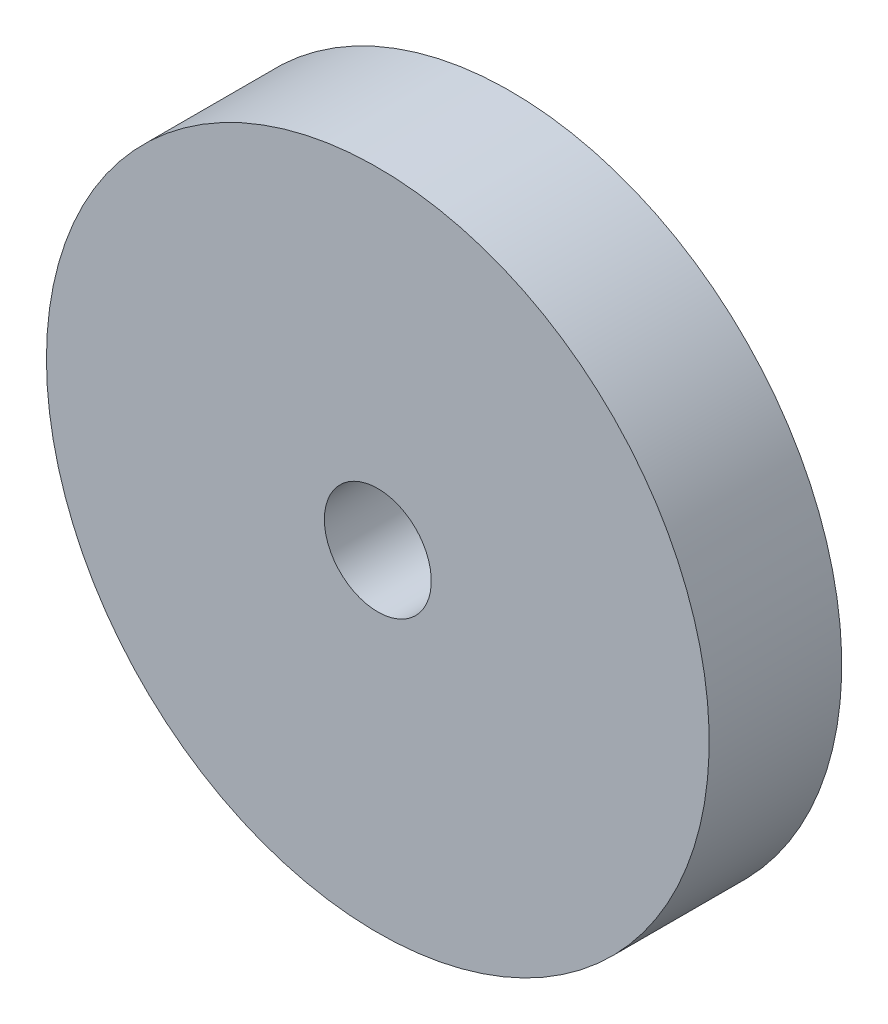
ISO-10303-21;
HEADER;
FILE_DESCRIPTION(('STEP AP214'),'2;1');
FILE_NAME('part.step','',(''),(''),'','','');
FILE_SCHEMA(('AUTOMOTIVE_DESIGN { 1 0 10303 214 1 1 1 1 }'));
ENDSEC;
DATA;
#1=APPLICATION_CONTEXT('core data for automotive mechanical design processes');
#2=APPLICATION_PROTOCOL_DEFINITION('international standard','automotive_design',2000,#1);
#3=PRODUCT_CONTEXT('',#1,'mechanical');
#4=PRODUCT('Part','Part','',(#3));
#5=PRODUCT_RELATED_PRODUCT_CATEGORY('part','',(#4));
#6=PRODUCT_DEFINITION_FORMATION('','',#4);
#7=PRODUCT_DEFINITION_CONTEXT('part definition',#1,'design');
#8=PRODUCT_DEFINITION('design','',#6,#7);
#9=PRODUCT_DEFINITION_SHAPE('','',#8);
#10=(LENGTH_UNIT() NAMED_UNIT(*) SI_UNIT(.MILLI.,.METRE.));
#11=(NAMED_UNIT(*) PLANE_ANGLE_UNIT() SI_UNIT($,.RADIAN.));
#12=(NAMED_UNIT(*) SI_UNIT($,.STERADIAN.) SOLID_ANGLE_UNIT());
#13=UNCERTAINTY_MEASURE_WITH_UNIT(LENGTH_MEASURE(1.E-05),#10,'distance_accuracy_value','');
#14=(GEOMETRIC_REPRESENTATION_CONTEXT(3) GLOBAL_UNCERTAINTY_ASSIGNED_CONTEXT((#13)) GLOBAL_UNIT_ASSIGNED_CONTEXT((#10,
#11,#12)) REPRESENTATION_CONTEXT('',''));
#15=CARTESIAN_POINT('',(0.,0.,0.));
#16=DIRECTION('',(0.,0.,1.));
#17=DIRECTION('',(1.,0.,0.));
#18=AXIS2_PLACEMENT_3D('',#15,#16,#17);
#19=CARTESIAN_POINT('',(0.,0.,6.2));
#20=DIRECTION('',(0.,0.,1.));
#21=DIRECTION('',(1.,0.,0.));
#22=AXIS2_PLACEMENT_3D('',#19,#20,#21);
#23=PLANE('',#22);
#24=CARTESIAN_POINT('',(0.,0.,6.2));
#25=DIRECTION('',(0.,0.,1.));
#26=DIRECTION('',(1.,0.,0.));
#27=AXIS2_PLACEMENT_3D('',#24,#25,#26);
#28=CIRCLE('',#27,15.5);
#29=CARTESIAN_POINT('',(-15.5,0.,6.2));
#30=VERTEX_POINT('',#29);
#31=EDGE_CURVE('E10',#30,#30,#28,.T.);
#32=ORIENTED_EDGE('',*,*,#31,.T.);
#33=EDGE_LOOP('',(#32));
#34=FACE_BOUND('',#33,.T.);
#35=CARTESIAN_POINT('',(0.,0.,6.2));
#36=DIRECTION('',(0.,0.,1.));
#37=DIRECTION('',(1.,0.,0.));
#38=AXIS2_PLACEMENT_3D('',#35,#36,#37);
#39=CIRCLE('',#38,2.5);
#40=CARTESIAN_POINT('',(-2.5,0.,6.2));
#41=VERTEX_POINT('',#40);
#42=EDGE_CURVE('E42',#41,#41,#39,.T.);
#43=ORIENTED_EDGE('',*,*,#42,.F.);
#44=EDGE_LOOP('',(#43));
#45=FACE_BOUND('',#44,.T.);
#46=ADVANCED_FACE('F31',(#34,#45),#23,.T.);
#47=CARTESIAN_POINT('',(0.,0.,0.));
#48=DIRECTION('',(0.,0.,1.));
#49=DIRECTION('',(1.,0.,0.));
#50=AXIS2_PLACEMENT_3D('',#47,#48,#49);
#51=PLANE('',#50);
#52=CARTESIAN_POINT('',(0.,0.,0.));
#53=DIRECTION('',(0.,0.,1.));
#54=DIRECTION('',(1.,0.,0.));
#55=AXIS2_PLACEMENT_3D('',#52,#53,#54);
#56=CIRCLE('',#55,15.5);
#57=CARTESIAN_POINT('',(-15.5,0.,0.));
#58=VERTEX_POINT('',#57);
#59=EDGE_CURVE('E35',#58,#58,#56,.T.);
#60=ORIENTED_EDGE('',*,*,#59,.F.);
#61=EDGE_LOOP('',(#60));
#62=FACE_BOUND('',#61,.T.);
#63=CARTESIAN_POINT('',(0.,0.,0.));
#64=DIRECTION('',(0.,0.,1.));
#65=DIRECTION('',(1.,0.,0.));
#66=AXIS2_PLACEMENT_3D('',#63,#64,#65);
#67=CIRCLE('',#66,2.5);
#68=CARTESIAN_POINT('',(-2.5,0.,0.));
#69=VERTEX_POINT('',#68);
#70=EDGE_CURVE('E44',#69,#69,#67,.T.);
#71=ORIENTED_EDGE('',*,*,#70,.T.);
#72=EDGE_LOOP('',(#71));
#73=FACE_BOUND('',#72,.T.);
#74=ADVANCED_FACE('F54',(#62,#73),#51,.F.);
#75=CARTESIAN_POINT('',(0.,0.,6.2));
#76=DIRECTION('',(0.,0.,-1.));
#77=DIRECTION('',(-1.,0.,0.));
#78=AXIS2_PLACEMENT_3D('',#75,#76,#77);
#79=CYLINDRICAL_SURFACE('',#78,15.5);
#80=CARTESIAN_POINT('',(-15.5,0.,6.2));
#81=CARTESIAN_POINT('',(-15.5,0.,6.13541666666667));
#82=CARTESIAN_POINT('',(-15.5,0.,6.07083333333333));
#83=CARTESIAN_POINT('',(-15.5,0.,5.94166666666667));
#84=CARTESIAN_POINT('',(-15.5,0.,5.87708333333333));
#85=CARTESIAN_POINT('',(-15.5,0.,5.74791666666667));
#86=CARTESIAN_POINT('',(-15.5,0.,5.68333333333333));
#87=CARTESIAN_POINT('',(-15.5,0.,5.55416666666667));
#88=CARTESIAN_POINT('',(-15.5,0.,5.48958333333333));
#89=CARTESIAN_POINT('',(-15.5,0.,5.36041666666667));
#90=CARTESIAN_POINT('',(-15.5,0.,5.29583333333333));
#91=CARTESIAN_POINT('',(-15.5,0.,5.16666666666667));
#92=CARTESIAN_POINT('',(-15.5,0.,5.10208333333333));
#93=CARTESIAN_POINT('',(-15.5,0.,4.97291666666667));
#94=CARTESIAN_POINT('',(-15.5,0.,4.90833333333333));
#95=CARTESIAN_POINT('',(-15.5,0.,4.77916666666667));
#96=CARTESIAN_POINT('',(-15.5,0.,4.71458333333333));
#97=CARTESIAN_POINT('',(-15.5,0.,4.58541666666667));
#98=CARTESIAN_POINT('',(-15.5,0.,4.52083333333333));
#99=CARTESIAN_POINT('',(-15.5,0.,4.39166666666667));
#100=CARTESIAN_POINT('',(-15.5,0.,4.32708333333333));
#101=CARTESIAN_POINT('',(-15.5,0.,4.19791666666667));
#102=CARTESIAN_POINT('',(-15.5,0.,4.13333333333333));
#103=CARTESIAN_POINT('',(-15.5,0.,4.00416666666667));
#104=CARTESIAN_POINT('',(-15.5,0.,3.93958333333333));
#105=CARTESIAN_POINT('',(-15.5,0.,3.81041666666667));
#106=CARTESIAN_POINT('',(-15.5,0.,3.74583333333333));
#107=CARTESIAN_POINT('',(-15.5,0.,3.61666666666667));
#108=CARTESIAN_POINT('',(-15.5,0.,3.55208333333333));
#109=CARTESIAN_POINT('',(-15.5,0.,3.42291666666667));
#110=CARTESIAN_POINT('',(-15.5,0.,3.35833333333333));
#111=CARTESIAN_POINT('',(-15.5,0.,3.22916666666667));
#112=CARTESIAN_POINT('',(-15.5,0.,3.16458333333333));
#113=CARTESIAN_POINT('',(-15.5,0.,3.03541666666667));
#114=CARTESIAN_POINT('',(-15.5,0.,2.97083333333333));
#115=CARTESIAN_POINT('',(-15.5,0.,2.84166666666667));
#116=CARTESIAN_POINT('',(-15.5,0.,2.77708333333333));
#117=CARTESIAN_POINT('',(-15.5,0.,2.64791666666667));
#118=CARTESIAN_POINT('',(-15.5,0.,2.58333333333333));
#119=CARTESIAN_POINT('',(-15.5,0.,2.45416666666667));
#120=CARTESIAN_POINT('',(-15.5,0.,2.38958333333333));
#121=CARTESIAN_POINT('',(-15.5,0.,2.26041666666667));
#122=CARTESIAN_POINT('',(-15.5,0.,2.19583333333333));
#123=CARTESIAN_POINT('',(-15.5,0.,2.06666666666667));
#124=CARTESIAN_POINT('',(-15.5,0.,2.00208333333333));
#125=CARTESIAN_POINT('',(-15.5,0.,1.87291666666667));
#126=CARTESIAN_POINT('',(-15.5,0.,1.80833333333333));
#127=CARTESIAN_POINT('',(-15.5,0.,1.67916666666667));
#128=CARTESIAN_POINT('',(-15.5,0.,1.61458333333333));
#129=CARTESIAN_POINT('',(-15.5,0.,1.48541666666667));
#130=CARTESIAN_POINT('',(-15.5,0.,1.42083333333333));
#131=CARTESIAN_POINT('',(-15.5,0.,1.29166666666667));
#132=CARTESIAN_POINT('',(-15.5,0.,1.22708333333333));
#133=CARTESIAN_POINT('',(-15.5,0.,1.09791666666667));
#134=CARTESIAN_POINT('',(-15.5,0.,1.03333333333333));
#135=CARTESIAN_POINT('',(-15.5,0.,0.904166666666667));
#136=CARTESIAN_POINT('',(-15.5,0.,0.839583333333333));
#137=CARTESIAN_POINT('',(-15.5,0.,0.710416666666666));
#138=CARTESIAN_POINT('',(-15.5,0.,0.645833333333333));
#139=CARTESIAN_POINT('',(-15.5,0.,0.516666666666667));
#140=CARTESIAN_POINT('',(-15.5,0.,0.452083333333333));
#141=CARTESIAN_POINT('',(-15.5,0.,0.322916666666667));
#142=CARTESIAN_POINT('',(-15.5,0.,0.258333333333334));
#143=CARTESIAN_POINT('',(-15.5,0.,0.129166666666667));
#144=CARTESIAN_POINT('',(-15.5,0.,0.0645833333333335));
#145=CARTESIAN_POINT('',(-15.5,0.,0.));
#146=B_SPLINE_CURVE_WITH_KNOTS('',3,(#80,#81,#82,#83,#84,#85,#86,#87,#88,#89,#90,#91,#92,#93,
#94,#95,#96,#97,#98,#99,#100,#101,#102,#103,#104,#105,#106,#107,#108,#109,#110,#111,#112,#113,
#114,#115,#116,#117,#118,#119,#120,#121,#122,#123,#124,#125,#126,#127,#128,#129,#130,#131,#132,
#133,#134,#135,#136,#137,#138,#139,#140,#141,#142,#143,#144,#145),.UNSPECIFIED.,.F.,.F.,(4,2,2,
2,2,2,2,2,2,2,2,2,2,2,2,2,2,2,2,2,2,2,2,2,2,2,2,2,2,2,2,2,4),(0.,0.19375,0.387500000000001,
0.58125,0.775,0.96875,1.1625,1.35625,1.55,1.74375,1.9375,2.13125,2.325,2.51875,2.7125,2.90625,
3.1,3.29375,3.4875,3.68125,3.875,4.06875,4.2625,4.45625,4.65,4.84375,5.0375,5.23125,5.425,
5.61875,5.8125,6.00625,6.2),.UNSPECIFIED.);
#147=EDGE_CURVE('BSEAM33',#30,#58,#146,.T.);
#148=ORIENTED_EDGE('',*,*,#31,.F.);
#149=ORIENTED_EDGE('',*,*,#59,.T.);
#150=ORIENTED_EDGE('',*,*,#147,.T.);
#151=ORIENTED_EDGE('',*,*,#147,.F.);
#152=EDGE_LOOP('',(#148,#150,#149,#151));
#153=FACE_BOUND('',#152,.T.);
#154=ADVANCED_FACE('F33',(#153),#79,.T.);
#155=CARTESIAN_POINT('',(0.,0.,6.2));
#156=DIRECTION('',(0.,0.,-1.));
#157=DIRECTION('',(-1.,0.,0.));
#158=AXIS2_PLACEMENT_3D('',#155,#156,#157);
#159=CYLINDRICAL_SURFACE('',#158,2.5);
#160=CARTESIAN_POINT('',(-2.5,0.,6.2));
#161=CARTESIAN_POINT('',(-2.5,0.,6.13541666666667));
#162=CARTESIAN_POINT('',(-2.5,0.,6.07083333333333));
#163=CARTESIAN_POINT('',(-2.5,0.,5.94166666666667));
#164=CARTESIAN_POINT('',(-2.5,0.,5.87708333333333));
#165=CARTESIAN_POINT('',(-2.5,0.,5.74791666666667));
#166=CARTESIAN_POINT('',(-2.5,0.,5.68333333333333));
#167=CARTESIAN_POINT('',(-2.5,0.,5.55416666666667));
#168=CARTESIAN_POINT('',(-2.5,0.,5.48958333333333));
#169=CARTESIAN_POINT('',(-2.5,0.,5.36041666666667));
#170=CARTESIAN_POINT('',(-2.5,0.,5.29583333333333));
#171=CARTESIAN_POINT('',(-2.5,0.,5.16666666666667));
#172=CARTESIAN_POINT('',(-2.5,0.,5.10208333333333));
#173=CARTESIAN_POINT('',(-2.5,0.,4.97291666666667));
#174=CARTESIAN_POINT('',(-2.5,0.,4.90833333333333));
#175=CARTESIAN_POINT('',(-2.5,0.,4.77916666666667));
#176=CARTESIAN_POINT('',(-2.5,0.,4.71458333333333));
#177=CARTESIAN_POINT('',(-2.5,0.,4.58541666666667));
#178=CARTESIAN_POINT('',(-2.5,0.,4.52083333333333));
#179=CARTESIAN_POINT('',(-2.5,0.,4.39166666666667));
#180=CARTESIAN_POINT('',(-2.5,0.,4.32708333333333));
#181=CARTESIAN_POINT('',(-2.5,0.,4.19791666666667));
#182=CARTESIAN_POINT('',(-2.5,0.,4.13333333333333));
#183=CARTESIAN_POINT('',(-2.5,0.,4.00416666666667));
#184=CARTESIAN_POINT('',(-2.5,0.,3.93958333333333));
#185=CARTESIAN_POINT('',(-2.5,0.,3.81041666666667));
#186=CARTESIAN_POINT('',(-2.5,0.,3.74583333333333));
#187=CARTESIAN_POINT('',(-2.5,0.,3.61666666666667));
#188=CARTESIAN_POINT('',(-2.5,0.,3.55208333333333));
#189=CARTESIAN_POINT('',(-2.5,0.,3.42291666666667));
#190=CARTESIAN_POINT('',(-2.5,0.,3.35833333333333));
#191=CARTESIAN_POINT('',(-2.5,0.,3.22916666666667));
#192=CARTESIAN_POINT('',(-2.5,0.,3.16458333333333));
#193=CARTESIAN_POINT('',(-2.5,0.,3.03541666666667));
#194=CARTESIAN_POINT('',(-2.5,0.,2.97083333333333));
#195=CARTESIAN_POINT('',(-2.5,0.,2.84166666666667));
#196=CARTESIAN_POINT('',(-2.5,0.,2.77708333333333));
#197=CARTESIAN_POINT('',(-2.5,0.,2.64791666666667));
#198=CARTESIAN_POINT('',(-2.5,0.,2.58333333333333));
#199=CARTESIAN_POINT('',(-2.5,0.,2.45416666666667));
#200=CARTESIAN_POINT('',(-2.5,0.,2.38958333333333));
#201=CARTESIAN_POINT('',(-2.5,0.,2.26041666666667));
#202=CARTESIAN_POINT('',(-2.5,0.,2.19583333333333));
#203=CARTESIAN_POINT('',(-2.5,0.,2.06666666666667));
#204=CARTESIAN_POINT('',(-2.5,0.,2.00208333333333));
#205=CARTESIAN_POINT('',(-2.5,0.,1.87291666666667));
#206=CARTESIAN_POINT('',(-2.5,0.,1.80833333333333));
#207=CARTESIAN_POINT('',(-2.5,0.,1.67916666666667));
#208=CARTESIAN_POINT('',(-2.5,0.,1.61458333333333));
#209=CARTESIAN_POINT('',(-2.5,0.,1.48541666666667));
#210=CARTESIAN_POINT('',(-2.5,0.,1.42083333333333));
#211=CARTESIAN_POINT('',(-2.5,0.,1.29166666666667));
#212=CARTESIAN_POINT('',(-2.5,0.,1.22708333333333));
#213=CARTESIAN_POINT('',(-2.5,0.,1.09791666666667));
#214=CARTESIAN_POINT('',(-2.5,0.,1.03333333333333));
#215=CARTESIAN_POINT('',(-2.5,0.,0.904166666666667));
#216=CARTESIAN_POINT('',(-2.5,0.,0.839583333333333));
#217=CARTESIAN_POINT('',(-2.5,0.,0.710416666666666));
#218=CARTESIAN_POINT('',(-2.5,0.,0.645833333333333));
#219=CARTESIAN_POINT('',(-2.5,0.,0.516666666666667));
#220=CARTESIAN_POINT('',(-2.5,0.,0.452083333333333));
#221=CARTESIAN_POINT('',(-2.5,0.,0.322916666666667));
#222=CARTESIAN_POINT('',(-2.5,0.,0.258333333333334));
#223=CARTESIAN_POINT('',(-2.5,0.,0.129166666666667));
#224=CARTESIAN_POINT('',(-2.5,0.,0.0645833333333335));
#225=CARTESIAN_POINT('',(-2.5,0.,0.));
#226=B_SPLINE_CURVE_WITH_KNOTS('',3,(#160,#161,#162,#163,#164,#165,#166,#167,#168,#169,#170,
#171,#172,#173,#174,#175,#176,#177,#178,#179,#180,#181,#182,#183,#184,#185,#186,#187,#188,#189,
#190,#191,#192,#193,#194,#195,#196,#197,#198,#199,#200,#201,#202,#203,#204,#205,#206,#207,#208,
#209,#210,#211,#212,#213,#214,#215,#216,#217,#218,#219,#220,#221,#222,#223,#224,#225),
.UNSPECIFIED.,.F.,.F.,(4,2,2,2,2,2,2,2,2,2,2,2,2,2,2,2,2,2,2,2,2,2,2,2,2,2,2,2,2,2,2,2,4),(0.,
0.193749999999999,0.3875,0.581249999999999,0.775,0.968749999999999,1.1625,1.35625,1.55,1.74375,
1.9375,2.13125,2.325,2.51875,2.7125,2.90625,3.1,3.29375,3.4875,3.68125,3.875,4.06875,4.2625,
4.45625,4.65,4.84375,5.0375,5.23125,5.425,5.61875,5.8125,6.00625,6.2),.UNSPECIFIED.);
#227=EDGE_CURVE('BSEAM50',#41,#69,#226,.T.);
#228=ORIENTED_EDGE('',*,*,#42,.T.);
#229=ORIENTED_EDGE('',*,*,#70,.F.);
#230=ORIENTED_EDGE('',*,*,#227,.T.);
#231=ORIENTED_EDGE('',*,*,#227,.F.);
#232=EDGE_LOOP('',(#228,#230,#229,#231));
#233=FACE_BOUND('',#232,.T.);
#234=ADVANCED_FACE('F50',(#233),#159,.F.);
#235=CLOSED_SHELL('',(#46,#74,#154,#234));
#236=MANIFOLD_SOLID_BREP('B2',#235);
#237=ADVANCED_BREP_SHAPE_REPRESENTATION('',(#18,#236),#14);
#238=SHAPE_DEFINITION_REPRESENTATION(#9,#237);
ENDSEC;
END-ISO-10303-21;
